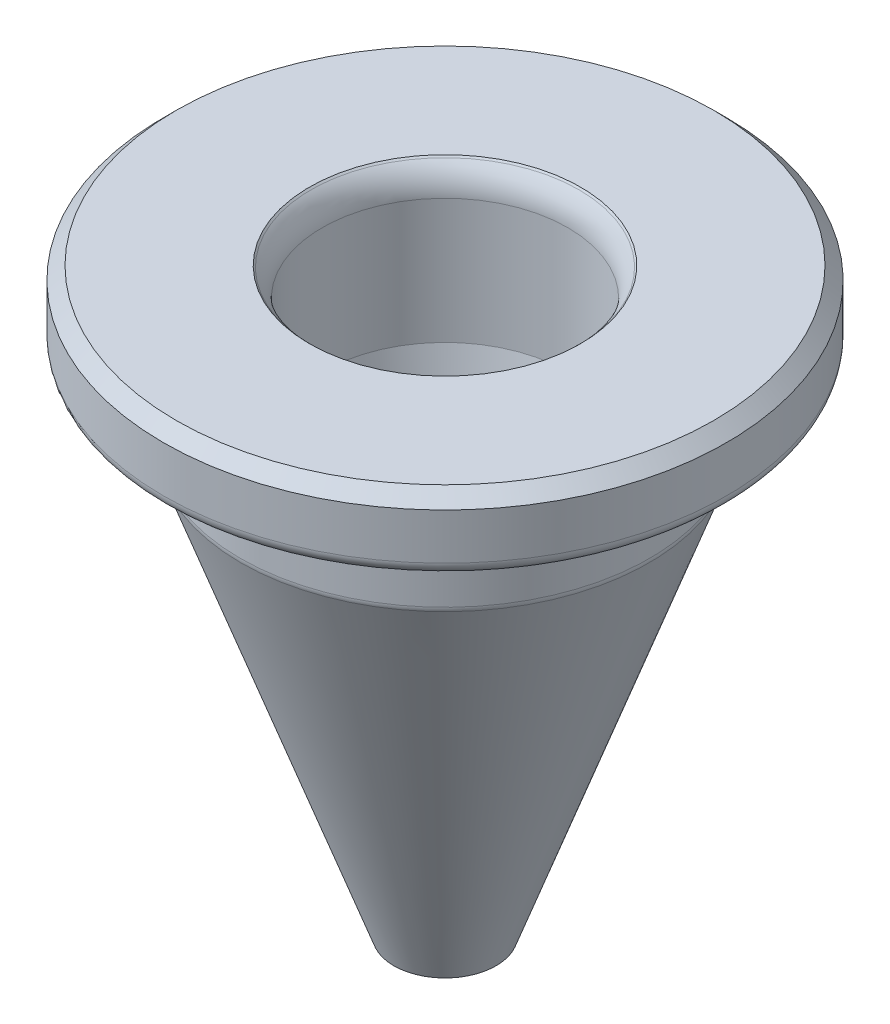
ISO-10303-21;
HEADER;
FILE_DESCRIPTION(('STEP AP214'),'2;1');
FILE_NAME('part.step','',(''),(''),'','','');
FILE_SCHEMA(('AUTOMOTIVE_DESIGN { 1 0 10303 214 1 1 1 1 }'));
ENDSEC;
DATA;
#1=APPLICATION_CONTEXT('core data for automotive mechanical design processes');
#2=APPLICATION_PROTOCOL_DEFINITION('international standard','automotive_design',2000,#1);
#3=PRODUCT_CONTEXT('',#1,'mechanical');
#4=PRODUCT('Part','Part','',(#3));
#5=PRODUCT_RELATED_PRODUCT_CATEGORY('part','',(#4));
#6=PRODUCT_DEFINITION_FORMATION('','',#4);
#7=PRODUCT_DEFINITION_CONTEXT('part definition',#1,'design');
#8=PRODUCT_DEFINITION('design','',#6,#7);
#9=PRODUCT_DEFINITION_SHAPE('','',#8);
#10=(LENGTH_UNIT() NAMED_UNIT(*) SI_UNIT(.MILLI.,.METRE.));
#11=(NAMED_UNIT(*) PLANE_ANGLE_UNIT() SI_UNIT($,.RADIAN.));
#12=(NAMED_UNIT(*) SI_UNIT($,.STERADIAN.) SOLID_ANGLE_UNIT());
#13=UNCERTAINTY_MEASURE_WITH_UNIT(LENGTH_MEASURE(1.E-05),#10,'distance_accuracy_value','');
#14=(GEOMETRIC_REPRESENTATION_CONTEXT(3) GLOBAL_UNCERTAINTY_ASSIGNED_CONTEXT((#13)) GLOBAL_UNIT_ASSIGNED_CONTEXT((#10,
#11,#12)) REPRESENTATION_CONTEXT('',''));
#15=CARTESIAN_POINT('',(0.,0.,0.));
#16=DIRECTION('',(0.,0.,1.));
#17=DIRECTION('',(1.,0.,0.));
#18=AXIS2_PLACEMENT_3D('',#15,#16,#17);
#19=CARTESIAN_POINT('',(0.,0.,0.));
#20=DIRECTION('',(0.,-1.,0.));
#21=DIRECTION('',(0.,0.,-1.));
#22=AXIS2_PLACEMENT_3D('',#19,#20,#21);
#23=CYLINDRICAL_SURFACE('',#22,8.);
#24=CARTESIAN_POINT('',(0.,19.7,0.));
#25=DIRECTION('',(0.,1.,0.));
#26=DIRECTION('',(0.,0.,1.));
#27=AXIS2_PLACEMENT_3D('',#24,#25,#26);
#28=CIRCLE('',#27,8.);
#29=CARTESIAN_POINT('',(0.,19.7,8.));
#30=VERTEX_POINT('',#29);
#31=EDGE_CURVE('E74',#30,#30,#28,.F.);
#32=ORIENTED_EDGE('',*,*,#31,.T.);
#33=EDGE_LOOP('',(#32));
#34=FACE_BOUND('',#33,.T.);
#35=CARTESIAN_POINT('',(0.,17.0870950149816,0.));
#36=DIRECTION('',(0.,1.,0.));
#37=DIRECTION('',(0.,0.,1.));
#38=AXIS2_PLACEMENT_3D('',#35,#36,#37);
#39=CIRCLE('',#38,8.);
#40=CARTESIAN_POINT('',(0.,17.0870950149816,8.));
#41=VERTEX_POINT('',#40);
#42=EDGE_CURVE('E77',#41,#41,#39,.T.);
#43=ORIENTED_EDGE('',*,*,#42,.T.);
#44=EDGE_LOOP('',(#43));
#45=FACE_BOUND('',#44,.T.);
#46=ADVANCED_FACE('F48',(#34,#45),#23,.T.);
#47=CARTESIAN_POINT('',(0.,0.,0.));
#48=DIRECTION('',(0.,1.,0.));
#49=DIRECTION('',(0.,0.,1.));
#50=AXIS2_PLACEMENT_3D('',#47,#48,#49);
#51=CONICAL_SURFACE('',#50,1.5,1.03037682652431);
#52=CARTESIAN_POINT('',(0.,0.3,0.));
#53=DIRECTION('',(0.,-1.,0.));
#54=DIRECTION('',(0.,0.,-1.));
#55=AXIS2_PLACEMENT_3D('',#52,#53,#54);
#56=CIRCLE('',#55,2.);
#57=CARTESIAN_POINT('',(0.,0.3,2.));
#58=VERTEX_POINT('',#57);
#59=EDGE_CURVE('E95',#58,#58,#56,.T.);
#60=ORIENTED_EDGE('',*,*,#59,.T.);
#61=EDGE_LOOP('',(#60));
#62=FACE_BOUND('',#61,.T.);
#63=CARTESIAN_POINT('',(0.,0.,0.));
#64=DIRECTION('',(0.,-1.,0.));
#65=DIRECTION('',(0.,0.,-1.));
#66=AXIS2_PLACEMENT_3D('',#63,#64,#65);
#67=CIRCLE('',#66,1.5);
#68=CARTESIAN_POINT('',(0.,0.,1.5));
#69=VERTEX_POINT('',#68);
#70=EDGE_CURVE('E89',#69,#69,#67,.T.);
#71=ORIENTED_EDGE('',*,*,#70,.F.);
#72=EDGE_LOOP('',(#71));
#73=FACE_BOUND('',#72,.T.);
#74=ADVANCED_FACE('F99',(#62,#73),#51,.T.);
#75=CARTESIAN_POINT('',(0.,17.,0.));
#76=DIRECTION('',(0.,1.,0.));
#77=DIRECTION('',(0.,0.,1.));
#78=AXIS2_PLACEMENT_3D('',#75,#76,#77);
#79=CONICAL_SURFACE('',#78,4.8,0.191733106213508);
#80=CARTESIAN_POINT('',(0.,17.,0.));
#81=DIRECTION('',(0.,-1.,0.));
#82=DIRECTION('',(0.,0.,-1.));
#83=AXIS2_PLACEMENT_3D('',#80,#81,#82);
#84=CIRCLE('',#83,4.8);
#85=CARTESIAN_POINT('',(0.,17.,4.8));
#86=VERTEX_POINT('',#85);
#87=EDGE_CURVE('E92',#86,#86,#84,.T.);
#88=CARTESIAN_POINT('',(0.,0.,1.5));
#89=CARTESIAN_POINT('',(0.,0.177083333333337,1.534375));
#90=CARTESIAN_POINT('',(0.,0.35416666666667,1.56875));
#91=CARTESIAN_POINT('',(0.,0.708333333333337,1.6375));
#92=CARTESIAN_POINT('',(0.,0.885416666666671,1.671875));
#93=CARTESIAN_POINT('',(0.,1.23958333333334,1.740625));
#94=CARTESIAN_POINT('',(0.,1.41666666666667,1.775));
#95=CARTESIAN_POINT('',(0.,1.77083333333334,1.84375));
#96=CARTESIAN_POINT('',(0.,1.94791666666667,1.878125));
#97=CARTESIAN_POINT('',(0.,2.30208333333334,1.946875));
#98=CARTESIAN_POINT('',(0.,2.47916666666667,1.98125));
#99=CARTESIAN_POINT('',(0.,2.83333333333334,2.05));
#100=CARTESIAN_POINT('',(0.,3.01041666666667,2.084375));
#101=CARTESIAN_POINT('',(0.,3.36458333333334,2.153125));
#102=CARTESIAN_POINT('',(0.,3.54166666666667,2.1875));
#103=CARTESIAN_POINT('',(0.,3.89583333333334,2.25625));
#104=CARTESIAN_POINT('',(0.,4.07291666666667,2.290625));
#105=CARTESIAN_POINT('',(0.,4.42708333333334,2.359375));
#106=CARTESIAN_POINT('',(0.,4.60416666666667,2.39375));
#107=CARTESIAN_POINT('',(0.,4.95833333333334,2.4625));
#108=CARTESIAN_POINT('',(0.,5.13541666666667,2.496875));
#109=CARTESIAN_POINT('',(0.,5.48958333333334,2.565625));
#110=CARTESIAN_POINT('',(0.,5.66666666666667,2.6));
#111=CARTESIAN_POINT('',(0.,6.02083333333334,2.66875));
#112=CARTESIAN_POINT('',(0.,6.19791666666667,2.703125));
#113=CARTESIAN_POINT('',(0.,6.55208333333334,2.771875));
#114=CARTESIAN_POINT('',(0.,6.72916666666667,2.80625));
#115=CARTESIAN_POINT('',(0.,7.08333333333334,2.875));
#116=CARTESIAN_POINT('',(0.,7.26041666666667,2.909375));
#117=CARTESIAN_POINT('',(0.,7.61458333333334,2.978125));
#118=CARTESIAN_POINT('',(0.,7.79166666666667,3.0125));
#119=CARTESIAN_POINT('',(0.,8.14583333333333,3.08125));
#120=CARTESIAN_POINT('',(0.,8.32291666666667,3.115625));
#121=CARTESIAN_POINT('',(0.,8.67708333333334,3.184375));
#122=CARTESIAN_POINT('',(0.,8.85416666666667,3.21875));
#123=CARTESIAN_POINT('',(0.,9.20833333333334,3.2875));
#124=CARTESIAN_POINT('',(0.,9.38541666666667,3.321875));
#125=CARTESIAN_POINT('',(0.,9.73958333333333,3.390625));
#126=CARTESIAN_POINT('',(0.,9.91666666666667,3.425));
#127=CARTESIAN_POINT('',(0.,10.2708333333333,3.49375));
#128=CARTESIAN_POINT('',(0.,10.4479166666667,3.528125));
#129=CARTESIAN_POINT('',(0.,10.8020833333333,3.596875));
#130=CARTESIAN_POINT('',(0.,10.9791666666667,3.63125));
#131=CARTESIAN_POINT('',(0.,11.3333333333333,3.7));
#132=CARTESIAN_POINT('',(0.,11.5104166666667,3.734375));
#133=CARTESIAN_POINT('',(0.,11.8645833333333,3.803125));
#134=CARTESIAN_POINT('',(0.,12.0416666666667,3.8375));
#135=CARTESIAN_POINT('',(0.,12.3958333333333,3.90625));
#136=CARTESIAN_POINT('',(0.,12.5729166666667,3.940625));
#137=CARTESIAN_POINT('',(0.,12.9270833333333,4.009375));
#138=CARTESIAN_POINT('',(0.,13.1041666666667,4.04375));
#139=CARTESIAN_POINT('',(0.,13.4583333333333,4.1125));
#140=CARTESIAN_POINT('',(0.,13.6354166666667,4.146875));
#141=CARTESIAN_POINT('',(0.,13.9895833333333,4.215625));
#142=CARTESIAN_POINT('',(0.,14.1666666666667,4.25));
#143=CARTESIAN_POINT('',(0.,14.5208333333333,4.31875));
#144=CARTESIAN_POINT('',(0.,14.6979166666667,4.353125));
#145=CARTESIAN_POINT('',(0.,15.0520833333333,4.421875));
#146=CARTESIAN_POINT('',(0.,15.2291666666667,4.45625));
#147=CARTESIAN_POINT('',(0.,15.5833333333333,4.525));
#148=CARTESIAN_POINT('',(0.,15.7604166666667,4.559375));
#149=CARTESIAN_POINT('',(0.,16.1145833333333,4.628125));
#150=CARTESIAN_POINT('',(0.,16.2916666666667,4.6625));
#151=CARTESIAN_POINT('',(0.,16.6458333333333,4.73125));
#152=CARTESIAN_POINT('',(0.,16.8229166666667,4.765625));
#153=CARTESIAN_POINT('',(0.,17.,4.8));
#154=B_SPLINE_CURVE_WITH_KNOTS('',3,(#88,#89,#90,#91,#92,#93,#94,#95,#96,#97,#98,#99,#100,#101,
#102,#103,#104,#105,#106,#107,#108,#109,#110,#111,#112,#113,#114,#115,#116,#117,#118,#119,#120,
#121,#122,#123,#124,#125,#126,#127,#128,#129,#130,#131,#132,#133,#134,#135,#136,#137,#138,#139,
#140,#141,#142,#143,#144,#145,#146,#147,#148,#149,#150,#151,#152,#153),.UNSPECIFIED.,.F.,.F.,(4,
2,2,2,2,2,2,2,2,2,2,2,2,2,2,2,2,2,2,2,2,2,2,2,2,2,2,2,2,2,2,2,4),(0.,0.541166636189816,
1.08233327237963,1.62349990856945,2.16466654475926,2.70583318094908,3.24699981713889,
3.78816645332871,4.32933308951852,4.87049972570834,5.41166636189815,5.95283299808797,
6.49399963427778,7.0351662704676,7.57633290665742,8.11749954284723,8.65866617903705,
9.19983281522686,9.74099945141668,10.2821660876065,10.8233327237963,11.3644993599861,
11.9056659961759,12.4468326323657,12.9879992685556,13.5291659047454,14.0703325409352,
14.611499177125,15.1526658133148,15.6938324495046,16.2349990856945,16.7761657218843,
17.3173323580741),.UNSPECIFIED.);
#155=EDGE_CURVE('BSEAM126',#69,#86,#154,.T.);
#156=ORIENTED_EDGE('',*,*,#70,.T.);
#157=ORIENTED_EDGE('',*,*,#87,.F.);
#158=ORIENTED_EDGE('',*,*,#155,.T.);
#159=ORIENTED_EDGE('',*,*,#155,.F.);
#160=EDGE_LOOP('',(#156,#158,#157,#159));
#161=FACE_BOUND('',#160,.T.);
#162=ADVANCED_FACE('F126',(#161),#79,.F.);
#163=CARTESIAN_POINT('',(0.,0.,0.));
#164=DIRECTION('',(0.,-1.,0.));
#165=DIRECTION('',(0.,0.,-1.));
#166=AXIS2_PLACEMENT_3D('',#163,#164,#165);
#167=CYLINDRICAL_SURFACE('',#166,4.8);
#168=CARTESIAN_POINT('',(0.,21.8786796564404,0.));
#169=DIRECTION('',(0.,-1.,0.));
#170=DIRECTION('',(0.,0.,-1.));
#171=AXIS2_PLACEMENT_3D('',#168,#169,#170);
#172=CIRCLE('',#171,4.8);
#173=CARTESIAN_POINT('',(0.,21.8786796564404,-4.8));
#174=VERTEX_POINT('',#173);
#175=EDGE_CURVE('E55',#174,#174,#172,.F.);
#176=ORIENTED_EDGE('',*,*,#175,.T.);
#177=EDGE_LOOP('',(#176));
#178=FACE_BOUND('',#177,.T.);
#179=ORIENTED_EDGE('',*,*,#87,.T.);
#180=EDGE_LOOP('',(#179));
#181=FACE_BOUND('',#180,.T.);
#182=ADVANCED_FACE('F117',(#178,#181),#167,.F.);
#183=CARTESIAN_POINT('',(4.8,23.,0.));
#184=DIRECTION('',(0.,1.,0.));
#185=DIRECTION('',(0.,0.,1.));
#186=AXIS2_PLACEMENT_3D('',#183,#184,#185);
#187=PLANE('',#186);
#188=CARTESIAN_POINT('',(0.,23.,0.));
#189=DIRECTION('',(0.,1.,0.));
#190=DIRECTION('',(0.,0.,1.));
#191=AXIS2_PLACEMENT_3D('',#188,#189,#190);
#192=CIRCLE('',#191,5.3);
#193=CARTESIAN_POINT('',(0.,23.,5.3));
#194=VERTEX_POINT('',#193);
#195=EDGE_CURVE('E63',#194,#194,#192,.F.);
#196=ORIENTED_EDGE('',*,*,#195,.T.);
#197=EDGE_LOOP('',(#196));
#198=FACE_BOUND('',#197,.T.);
#199=CARTESIAN_POINT('',(0.,23.,0.));
#200=DIRECTION('',(0.,1.,0.));
#201=DIRECTION('',(0.,0.,1.));
#202=AXIS2_PLACEMENT_3D('',#199,#200,#201);
#203=CIRCLE('',#202,10.5);
#204=CARTESIAN_POINT('',(0.,23.,10.5));
#205=VERTEX_POINT('',#204);
#206=EDGE_CURVE('E68',#205,#205,#203,.T.);
#207=ORIENTED_EDGE('',*,*,#206,.T.);
#208=EDGE_LOOP('',(#207));
#209=FACE_BOUND('',#208,.T.);
#210=ADVANCED_FACE('F105',(#198,#209),#187,.T.);
#211=CARTESIAN_POINT('',(0.,0.3,0.));
#212=DIRECTION('',(0.,1.,0.));
#213=DIRECTION('',(0.,0.,1.));
#214=AXIS2_PLACEMENT_3D('',#211,#212,#213);
#215=CONICAL_SURFACE('',#214,2.,0.344919313435336);
#216=CARTESIAN_POINT('',(0.,16.9180346429807,0.));
#217=DIRECTION('',(0.,-1.,0.));
#218=DIRECTION('',(0.,0.,-1.));
#219=AXIS2_PLACEMENT_3D('',#216,#217,#218);
#220=CIRCLE('',#219,7.9705513687356);
#221=CARTESIAN_POINT('',(0.,16.9180346429807,7.9705513687356));
#222=VERTEX_POINT('',#221);
#223=EDGE_CURVE('E71',#222,#222,#220,.T.);
#224=CARTESIAN_POINT('',(0.,16.9180346429807,7.9705513687356));
#225=CARTESIAN_POINT('',(0.,16.7449301154497,7.90835812531127));
#226=CARTESIAN_POINT('',(0.,16.5718255879187,7.84616488188694));
#227=CARTESIAN_POINT('',(0.,16.2256165328566,7.72177839503828));
#228=CARTESIAN_POINT('',(0.,16.0525120053255,7.65958515161395));
#229=CARTESIAN_POINT('',(0.,15.7063029502634,7.5351986647653));
#230=CARTESIAN_POINT('',(0.,15.5331984227324,7.47300542134097));
#231=CARTESIAN_POINT('',(0.,15.1869893676703,7.34861893449231));
#232=CARTESIAN_POINT('',(0.,15.0138848401392,7.28642569106798));
#233=CARTESIAN_POINT('',(0.,14.6676757850771,7.16203920421932));
#234=CARTESIAN_POINT('',(0.,14.4945712575461,7.09984596079499));
#235=CARTESIAN_POINT('',(0.,14.148362202484,6.97545947394633));
#236=CARTESIAN_POINT('',(0.,13.9752576749529,6.913266230522));
#237=CARTESIAN_POINT('',(0.,13.6290486198908,6.78887974367335));
#238=CARTESIAN_POINT('',(0.,13.4559440923598,6.72668650024902));
#239=CARTESIAN_POINT('',(0.,13.1097350372977,6.60230001340036));
#240=CARTESIAN_POINT('',(0.,12.9366305097666,6.54010676997603));
#241=CARTESIAN_POINT('',(0.,12.5904214547045,6.41572028312737));
#242=CARTESIAN_POINT('',(0.,12.4173169271735,6.35352703970304));
#243=CARTESIAN_POINT('',(0.,12.0711078721114,6.22914055285438));
#244=CARTESIAN_POINT('',(0.,11.8980033445803,6.16694730943005));
#245=CARTESIAN_POINT('',(0.,11.5517942895182,6.04256082258139));
#246=CARTESIAN_POINT('',(0.,11.3786897619872,5.98036757915707));
#247=CARTESIAN_POINT('',(0.,11.0324807069251,5.85598109230841));
#248=CARTESIAN_POINT('',(0.,10.859376179394,5.79378784888408));
#249=CARTESIAN_POINT('',(0.,10.5131671243319,5.66940136203542));
#250=CARTESIAN_POINT('',(0.,10.3400625968009,5.60720811861109));
#251=CARTESIAN_POINT('',(0.,9.99385354173877,5.48282163176243));
#252=CARTESIAN_POINT('',(0.,9.82074901420772,5.4206283883381));
#253=CARTESIAN_POINT('',(0.,9.47453995914562,5.29624190148945));
#254=CARTESIAN_POINT('',(0.,9.30143543161457,5.23404865806512));
#255=CARTESIAN_POINT('',(0.,8.95522637655247,5.10966217121646));
#256=CARTESIAN_POINT('',(0.,8.78212184902142,5.04746892779213));
#257=CARTESIAN_POINT('',(0.,8.43591279395933,4.92308244094347));
#258=CARTESIAN_POINT('',(0.,8.26280826642827,4.86088919751914));
#259=CARTESIAN_POINT('',(0.,7.91659921136618,4.73650271067048));
#260=CARTESIAN_POINT('',(0.,7.74349468383513,4.67430946724615));
#261=CARTESIAN_POINT('',(0.,7.39728562877303,4.5499229803975));
#262=CARTESIAN_POINT('',(0.,7.22418110124198,4.48772973697317));
#263=CARTESIAN_POINT('',(0.,6.87797204617988,4.36334325012451));
#264=CARTESIAN_POINT('',(0.,6.70486751864883,4.30115000670018));
#265=CARTESIAN_POINT('',(0.,6.35865846358673,4.17676351985152));
#266=CARTESIAN_POINT('',(0.,6.18555393605568,4.11457027642719));
#267=CARTESIAN_POINT('',(0.,5.83934488099358,3.99018378957853));
#268=CARTESIAN_POINT('',(0.,5.66624035346253,3.9279905461542));
#269=CARTESIAN_POINT('',(0.,5.32003129840044,3.80360405930555));
#270=CARTESIAN_POINT('',(0.,5.14692677086938,3.74141081588122));
#271=CARTESIAN_POINT('',(0.,4.80071771580729,3.61702432903256));
#272=CARTESIAN_POINT('',(0.,4.62761318827624,3.55483108560823));
#273=CARTESIAN_POINT('',(0.,4.28140413321414,3.43044459875957));
#274=CARTESIAN_POINT('',(0.,4.10829960568309,3.36825135533524));
#275=CARTESIAN_POINT('',(0.,3.76209055062099,3.24386486848658));
#276=CARTESIAN_POINT('',(0.,3.58898602308994,3.18167162506225));
#277=CARTESIAN_POINT('',(0.,3.24277696802784,3.0572851382136));
#278=CARTESIAN_POINT('',(0.,3.06967244049679,2.99509189478927));
#279=CARTESIAN_POINT('',(0.,2.72346338543469,2.87070540794061));
#280=CARTESIAN_POINT('',(0.,2.55035885790364,2.80851216451628));
#281=CARTESIAN_POINT('',(0.,2.20414980284154,2.68412567766762));
#282=CARTESIAN_POINT('',(0.,2.0310452753105,2.62193243424329));
#283=CARTESIAN_POINT('',(0.,1.6848362202484,2.49754594739463));
#284=CARTESIAN_POINT('',(0.,1.51173169271735,2.4353527039703));
#285=CARTESIAN_POINT('',(0.,1.16552263765525,2.31096621712165));
#286=CARTESIAN_POINT('',(0.,0.992418110124198,2.24877297369732));
#287=CARTESIAN_POINT('',(0.,0.646209055062098,2.12438648684866));
#288=CARTESIAN_POINT('',(0.,0.473104527531049,2.06219324342433));
#289=CARTESIAN_POINT('',(0.,0.3,2.));
#290=B_SPLINE_CURVE_WITH_KNOTS('',3,(#224,#225,#226,#227,#228,#229,#230,#231,#232,#233,#234,
#235,#236,#237,#238,#239,#240,#241,#242,#243,#244,#245,#246,#247,#248,#249,#250,#251,#252,#253,
#254,#255,#256,#257,#258,#259,#260,#261,#262,#263,#264,#265,#266,#267,#268,#269,#270,#271,#272,
#273,#274,#275,#276,#277,#278,#279,#280,#281,#282,#283,#284,#285,#286,#287,#288,#289),
.UNSPECIFIED.,.F.,.F.,(4,2,2,2,2,2,2,2,2,2,2,2,2,2,2,2,2,2,2,2,2,2,2,2,2,2,2,2,2,2,2,2,4),(0.,
0.551813911399913,1.10362782279983,1.65544173419974,2.20725564559966,2.75906955699957,
3.31088346839948,3.8626973797994,4.41451129119931,4.96632520259923,5.51813911399914,
6.06995302539905,6.62176693679896,7.17358084819888,7.72539475959879,8.27720867099871,
8.82902258239862,9.38083649379853,9.93265040519845,10.4844643165984,11.0362782279983,
11.5880921393982,12.1399060507981,12.691719962198,13.2435338735979,13.7953477849978,
14.3471616963978,14.8989756077977,15.4507895191976,16.0026034305975,16.5544173419974,
17.1062312533973,17.6580451647972),.UNSPECIFIED.);
#291=EDGE_CURVE('BSEAM102',#222,#58,#290,.T.);
#292=ORIENTED_EDGE('',*,*,#223,.T.);
#293=ORIENTED_EDGE('',*,*,#59,.F.);
#294=ORIENTED_EDGE('',*,*,#291,.T.);
#295=ORIENTED_EDGE('',*,*,#291,.F.);
#296=EDGE_LOOP('',(#292,#294,#293,#295));
#297=FACE_BOUND('',#296,.T.);
#298=ADVANCED_FACE('F102',(#297),#215,.T.);
#299=CARTESIAN_POINT('',(0.,20.2,0.));
#300=DIRECTION('',(0.,1.,0.));
#301=DIRECTION('',(0.,0.,1.));
#302=AXIS2_PLACEMENT_3D('',#299,#300,#301);
#303=CYLINDRICAL_SURFACE('',#302,11.);
#304=CARTESIAN_POINT('',(0.,22.5,0.));
#305=DIRECTION('',(0.,1.,0.));
#306=DIRECTION('',(0.,0.,1.));
#307=AXIS2_PLACEMENT_3D('',#304,#305,#306);
#308=CIRCLE('',#307,11.);
#309=CARTESIAN_POINT('',(0.,22.5,11.));
#310=VERTEX_POINT('',#309);
#311=EDGE_CURVE('E59',#310,#310,#308,.F.);
#312=ORIENTED_EDGE('',*,*,#311,.T.);
#313=EDGE_LOOP('',(#312));
#314=FACE_BOUND('',#313,.T.);
#315=CARTESIAN_POINT('',(0.,20.7,0.));
#316=DIRECTION('',(0.,1.,0.));
#317=DIRECTION('',(0.,0.,1.));
#318=AXIS2_PLACEMENT_3D('',#315,#316,#317);
#319=CIRCLE('',#318,11.);
#320=CARTESIAN_POINT('',(0.,20.7,11.));
#321=VERTEX_POINT('',#320);
#322=EDGE_CURVE('E86',#321,#321,#319,.T.);
#323=ORIENTED_EDGE('',*,*,#322,.T.);
#324=EDGE_LOOP('',(#323));
#325=FACE_BOUND('',#324,.T.);
#326=ADVANCED_FACE('F104',(#314,#325),#303,.T.);
#327=CARTESIAN_POINT('',(0.,20.2,0.));
#328=DIRECTION('',(0.,1.,0.));
#329=DIRECTION('',(0.,0.,1.));
#330=AXIS2_PLACEMENT_3D('',#327,#328,#329);
#331=PLANE('',#330);
#332=CARTESIAN_POINT('',(0.,20.2,0.));
#333=DIRECTION('',(0.,1.,0.));
#334=DIRECTION('',(0.,0.,1.));
#335=AXIS2_PLACEMENT_3D('',#332,#333,#334);
#336=CIRCLE('',#335,10.5);
#337=CARTESIAN_POINT('',(0.,20.2,10.5));
#338=VERTEX_POINT('',#337);
#339=EDGE_CURVE('E80',#338,#338,#336,.F.);
#340=ORIENTED_EDGE('',*,*,#339,.T.);
#341=EDGE_LOOP('',(#340));
#342=FACE_BOUND('',#341,.T.);
#343=CARTESIAN_POINT('',(0.,20.2,0.));
#344=DIRECTION('',(0.,1.,0.));
#345=DIRECTION('',(0.,0.,1.));
#346=AXIS2_PLACEMENT_3D('',#343,#344,#345);
#347=CIRCLE('',#346,8.5);
#348=CARTESIAN_POINT('',(0.,20.2,8.5));
#349=VERTEX_POINT('',#348);
#350=EDGE_CURVE('E83',#349,#349,#347,.T.);
#351=ORIENTED_EDGE('',*,*,#350,.T.);
#352=EDGE_LOOP('',(#351));
#353=FACE_BOUND('',#352,.T.);
#354=ADVANCED_FACE('F113',(#342,#353),#331,.F.);
#355=CARTESIAN_POINT('',(0.,20.7,0.));
#356=DIRECTION('',(0.,1.,0.));
#357=DIRECTION('',(0.,0.,1.));
#358=AXIS2_PLACEMENT_3D('',#355,#356,#357);
#359=TOROIDAL_SURFACE('',#358,10.5,0.5);
#360=ORIENTED_EDGE('',*,*,#339,.F.);
#361=EDGE_LOOP('',(#360));
#362=FACE_BOUND('',#361,.T.);
#363=ORIENTED_EDGE('',*,*,#322,.F.);
#364=EDGE_LOOP('',(#363));
#365=FACE_BOUND('',#364,.T.);
#366=ADVANCED_FACE('F135',(#362,#365),#359,.T.);
#367=CARTESIAN_POINT('',(0.,19.7,0.));
#368=DIRECTION('',(0.,1.,0.));
#369=DIRECTION('',(0.,0.,1.));
#370=AXIS2_PLACEMENT_3D('',#367,#368,#369);
#371=TOROIDAL_SURFACE('',#370,8.5,0.5);
#372=ORIENTED_EDGE('',*,*,#350,.F.);
#373=EDGE_LOOP('',(#372));
#374=FACE_BOUND('',#373,.T.);
#375=ORIENTED_EDGE('',*,*,#31,.F.);
#376=EDGE_LOOP('',(#375));
#377=FACE_BOUND('',#376,.T.);
#378=ADVANCED_FACE('F138',(#374,#377),#371,.F.);
#379=CARTESIAN_POINT('',(0.,17.0870950149816,0.));
#380=DIRECTION('',(0.,1.,0.));
#381=DIRECTION('',(0.,0.,1.));
#382=AXIS2_PLACEMENT_3D('',#379,#380,#381);
#383=TOROIDAL_SURFACE('',#382,7.5,0.5);
#384=ORIENTED_EDGE('',*,*,#42,.F.);
#385=EDGE_LOOP('',(#384));
#386=FACE_BOUND('',#385,.T.);
#387=ORIENTED_EDGE('',*,*,#223,.F.);
#388=EDGE_LOOP('',(#387));
#389=FACE_BOUND('',#388,.T.);
#390=ADVANCED_FACE('F142',(#386,#389),#383,.T.);
#391=CARTESIAN_POINT('',(0.,23.,0.));
#392=DIRECTION('',(0.,1.,0.));
#393=DIRECTION('',(0.,0.,1.));
#394=AXIS2_PLACEMENT_3D('',#391,#392,#393);
#395=CONICAL_SURFACE('',#394,5.3,0.785398163397448);
#396=CARTESIAN_POINT('',(0.,22.9393398282202,0.));
#397=DIRECTION('',(0.,-1.,0.));
#398=DIRECTION('',(0.,0.,-1.));
#399=AXIS2_PLACEMENT_3D('',#396,#397,#398);
#400=CIRCLE('',#399,5.23933982822018);
#401=CARTESIAN_POINT('',(0.,22.9393398282202,-5.23933982822018));
#402=VERTEX_POINT('',#401);
#403=EDGE_CURVE('E11',#402,#402,#400,.T.);
#404=ORIENTED_EDGE('',*,*,#403,.T.);
#405=EDGE_LOOP('',(#404));
#406=FACE_BOUND('',#405,.T.);
#407=ORIENTED_EDGE('',*,*,#195,.F.);
#408=EDGE_LOOP('',(#407));
#409=FACE_BOUND('',#408,.T.);
#410=ADVANCED_FACE('F146',(#406,#409),#395,.F.);
#411=CARTESIAN_POINT('',(0.,23.,0.));
#412=DIRECTION('',(0.,-1.,0.));
#413=DIRECTION('',(0.,0.,-1.));
#414=AXIS2_PLACEMENT_3D('',#411,#412,#413);
#415=CONICAL_SURFACE('',#414,10.5,0.785398163397452);
#416=ORIENTED_EDGE('',*,*,#311,.F.);
#417=EDGE_LOOP('',(#416));
#418=FACE_BOUND('',#417,.T.);
#419=ORIENTED_EDGE('',*,*,#206,.F.);
#420=EDGE_LOOP('',(#419));
#421=FACE_BOUND('',#420,.T.);
#422=ADVANCED_FACE('F153',(#418,#421),#415,.T.);
#423=CARTESIAN_POINT('',(0.,21.8786796564404,0.));
#424=DIRECTION('',(0.,-1.,0.));
#425=DIRECTION('',(0.,0.,-1.));
#426=AXIS2_PLACEMENT_3D('',#423,#424,#425);
#427=TOROIDAL_SURFACE('',#426,6.3,1.5);
#428=ORIENTED_EDGE('',*,*,#403,.F.);
#429=EDGE_LOOP('',(#428));
#430=FACE_BOUND('',#429,.T.);
#431=ORIENTED_EDGE('',*,*,#175,.F.);
#432=EDGE_LOOP('',(#431));
#433=FACE_BOUND('',#432,.T.);
#434=ADVANCED_FACE('F50',(#430,#433),#427,.T.);
#435=CLOSED_SHELL('',(#46,#74,#162,#182,#210,#298,#326,#354,#366,#378,#390,#410,#422,#434));
#436=MANIFOLD_SOLID_BREP('B2',#435);
#437=ADVANCED_BREP_SHAPE_REPRESENTATION('',(#18,#436),#14);
#438=SHAPE_DEFINITION_REPRESENTATION(#9,#437);
ENDSEC;
END-ISO-10303-21;
